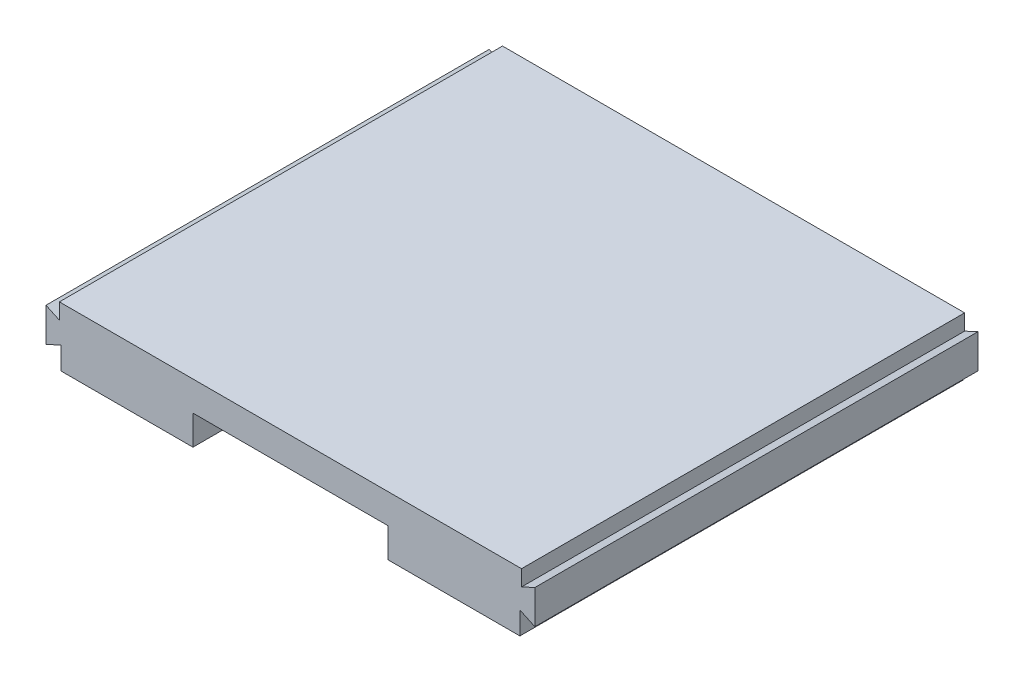
ISO-10303-21;
HEADER;
FILE_DESCRIPTION(('STEP AP214'),'2;1');
FILE_NAME('part.step','',(''),(''),'','','');
FILE_SCHEMA(('AUTOMOTIVE_DESIGN { 1 0 10303 214 1 1 1 1 }'));
ENDSEC;
DATA;
#1=APPLICATION_CONTEXT('core data for automotive mechanical design processes');
#2=APPLICATION_PROTOCOL_DEFINITION('international standard','automotive_design',2000,#1);
#3=PRODUCT_CONTEXT('',#1,'mechanical');
#4=PRODUCT('Part','Part','',(#3));
#5=PRODUCT_RELATED_PRODUCT_CATEGORY('part','',(#4));
#6=PRODUCT_DEFINITION_FORMATION('','',#4);
#7=PRODUCT_DEFINITION_CONTEXT('part definition',#1,'design');
#8=PRODUCT_DEFINITION('design','',#6,#7);
#9=PRODUCT_DEFINITION_SHAPE('','',#8);
#10=(LENGTH_UNIT() NAMED_UNIT(*) SI_UNIT(.MILLI.,.METRE.));
#11=(NAMED_UNIT(*) PLANE_ANGLE_UNIT() SI_UNIT($,.RADIAN.));
#12=(NAMED_UNIT(*) SI_UNIT($,.STERADIAN.) SOLID_ANGLE_UNIT());
#13=UNCERTAINTY_MEASURE_WITH_UNIT(LENGTH_MEASURE(1.E-05),#10,'distance_accuracy_value','');
#14=(GEOMETRIC_REPRESENTATION_CONTEXT(3) GLOBAL_UNCERTAINTY_ASSIGNED_CONTEXT((#13)) GLOBAL_UNIT_ASSIGNED_CONTEXT((#10,
#11,#12)) REPRESENTATION_CONTEXT('',''));
#15=CARTESIAN_POINT('',(0.,0.,0.));
#16=DIRECTION('',(0.,0.,1.));
#17=DIRECTION('',(1.,0.,0.));
#18=AXIS2_PLACEMENT_3D('',#15,#16,#17);
#19=CARTESIAN_POINT('',(-19.55,10.,-49.));
#20=DIRECTION('',(0.,0.,1.));
#21=DIRECTION('',(1.,0.,0.));
#22=AXIS2_PLACEMENT_3D('',#19,#20,#21);
#23=PLANE('',#22);
#24=DIRECTION('',(-1.,0.,0.));
#25=VECTOR('',#24,1.);
#26=CARTESIAN_POINT('',(0.,4.,-49.));
#27=LINE('',#26,#25);
#28=CARTESIAN_POINT('',(15.6441233676957,4.,-49.));
#29=VERTEX_POINT('',#28);
#30=CARTESIAN_POINT('',(-15.6441233676957,4.,-49.));
#31=VERTEX_POINT('',#30);
#32=EDGE_CURVE('E298',#29,#31,#27,.T.);
#33=ORIENTED_EDGE('',*,*,#32,.F.);
#34=DIRECTION('',(0.,1.,0.));
#35=VECTOR('',#34,1.);
#36=CARTESIAN_POINT('',(15.6441233676957,10.8742849021488,-49.));
#37=LINE('',#36,#35);
#38=CARTESIAN_POINT('',(15.6441233676957,2.92758278901282,-49.));
#39=VERTEX_POINT('',#38);
#40=EDGE_CURVE('E68',#39,#29,#37,.T.);
#41=ORIENTED_EDGE('',*,*,#40,.F.);
#42=DIRECTION('',(-0.906307787036648,-0.422618261740704,0.));
#43=VECTOR('',#42,1.);
#44=CARTESIAN_POINT('',(15.6441233676957,2.92758278901282,-49.));
#45=LINE('',#44,#43);
#46=CARTESIAN_POINT('',(16.55,3.35,-49.));
#47=VERTEX_POINT('',#46);
#48=EDGE_CURVE('E171',#47,#39,#45,.T.);
#49=ORIENTED_EDGE('',*,*,#48,.F.);
#50=DIRECTION('',(0.,1.,0.));
#51=VECTOR('',#50,1.);
#52=CARTESIAN_POINT('',(16.55,3.35,-49.));
#53=LINE('',#52,#51);
#54=CARTESIAN_POINT('',(16.55,1.05,-49.));
#55=VERTEX_POINT('',#54);
#56=EDGE_CURVE('E185',#55,#47,#53,.T.);
#57=ORIENTED_EDGE('',*,*,#56,.F.);
#58=DIRECTION('',(0.906307787036648,-0.422618261740704,0.));
#59=VECTOR('',#58,1.);
#60=CARTESIAN_POINT('',(16.55,1.05,-49.));
#61=LINE('',#60,#59);
#62=CARTESIAN_POINT('',(15.5348884992593,1.52335426667663,-49.));
#63=VERTEX_POINT('',#62);
#64=EDGE_CURVE('E164',#63,#55,#61,.T.);
#65=ORIENTED_EDGE('',*,*,#64,.F.);
#66=DIRECTION('',(0.,1.,0.));
#67=VECTOR('',#66,1.);
#68=CARTESIAN_POINT('',(15.5348884992593,-2.3477838682684,-49.));
#69=LINE('',#68,#67);
#70=CARTESIAN_POINT('',(15.5348884992593,0.,-49.));
#71=VERTEX_POINT('',#70);
#72=EDGE_CURVE('E174',#71,#63,#69,.T.);
#73=ORIENTED_EDGE('',*,*,#72,.F.);
#74=DIRECTION('',(-1.,0.,0.));
#75=VECTOR('',#74,1.);
#76=CARTESIAN_POINT('',(-19.55,0.,-49.));
#77=LINE('',#76,#75);
#78=CARTESIAN_POINT('',(6.6,0.,-48.9999999999999));
#79=VERTEX_POINT('',#78);
#80=EDGE_CURVE('E313',#71,#79,#77,.T.);
#81=ORIENTED_EDGE('',*,*,#80,.T.);
#82=DIRECTION('',(0.,-1.,0.));
#83=VECTOR('',#82,1.);
#84=CARTESIAN_POINT('',(6.6,2.,-48.9999999999999));
#85=LINE('',#84,#83);
#86=CARTESIAN_POINT('',(6.6,2.,-48.9999999999999));
#87=VERTEX_POINT('',#86);
#88=EDGE_CURVE('E285',#87,#79,#85,.T.);
#89=ORIENTED_EDGE('',*,*,#88,.F.);
#90=DIRECTION('',(-1.,0.,0.));
#91=VECTOR('',#90,1.);
#92=CARTESIAN_POINT('',(0.,2.,-48.9999999999999));
#93=LINE('',#92,#91);
#94=CARTESIAN_POINT('',(-6.6,2.,-48.9999999999999));
#95=VERTEX_POINT('',#94);
#96=EDGE_CURVE('E271',#87,#95,#93,.T.);
#97=ORIENTED_EDGE('',*,*,#96,.T.);
#98=DIRECTION('',(0.,-1.,0.));
#99=VECTOR('',#98,1.);
#100=CARTESIAN_POINT('',(-6.6,2.,-48.9999999999999));
#101=LINE('',#100,#99);
#102=CARTESIAN_POINT('',(-6.6,0.,-48.9999999999999));
#103=VERTEX_POINT('',#102);
#104=EDGE_CURVE('E275',#95,#103,#101,.T.);
#105=ORIENTED_EDGE('',*,*,#104,.T.);
#106=CARTESIAN_POINT('',(-15.5348884992593,0.,-49.));
#107=VERTEX_POINT('',#106);
#108=EDGE_CURVE('E312',#103,#107,#77,.T.);
#109=ORIENTED_EDGE('',*,*,#108,.T.);
#110=DIRECTION('',(0.,-1.,0.));
#111=VECTOR('',#110,1.);
#112=CARTESIAN_POINT('',(-15.5348884992593,-2.3477838682684,-49.));
#113=LINE('',#112,#111);
#114=CARTESIAN_POINT('',(-15.5348884992593,1.52335426667663,-49.));
#115=VERTEX_POINT('',#114);
#116=EDGE_CURVE('E208',#115,#107,#113,.T.);
#117=ORIENTED_EDGE('',*,*,#116,.F.);
#118=DIRECTION('',(0.906307787036648,0.422618261740704,0.));
#119=VECTOR('',#118,1.);
#120=CARTESIAN_POINT('',(-16.55,1.05,-49.));
#121=LINE('',#120,#119);
#122=CARTESIAN_POINT('',(-16.55,1.05,-49.));
#123=VERTEX_POINT('',#122);
#124=EDGE_CURVE('E220',#123,#115,#121,.T.);
#125=ORIENTED_EDGE('',*,*,#124,.F.);
#126=DIRECTION('',(0.,-1.,0.));
#127=VECTOR('',#126,1.);
#128=CARTESIAN_POINT('',(-16.55,3.35,-49.));
#129=LINE('',#128,#127);
#130=CARTESIAN_POINT('',(-16.55,3.35,-49.));
#131=VERTEX_POINT('',#130);
#132=EDGE_CURVE('E224',#131,#123,#129,.T.);
#133=ORIENTED_EDGE('',*,*,#132,.F.);
#134=DIRECTION('',(-0.906307787036648,0.422618261740704,0.));
#135=VECTOR('',#134,1.);
#136=CARTESIAN_POINT('',(-15.6441233676957,2.92758278901282,-49.));
#137=LINE('',#136,#135);
#138=CARTESIAN_POINT('',(-15.6441233676957,2.92758278901282,-49.));
#139=VERTEX_POINT('',#138);
#140=EDGE_CURVE('E228',#139,#131,#137,.T.);
#141=ORIENTED_EDGE('',*,*,#140,.F.);
#142=DIRECTION('',(0.,-1.,0.));
#143=VECTOR('',#142,1.);
#144=CARTESIAN_POINT('',(-15.6441233676957,10.8742849021488,-49.));
#145=LINE('',#144,#143);
#146=EDGE_CURVE('E232',#31,#139,#145,.T.);
#147=ORIENTED_EDGE('',*,*,#146,.F.);
#148=EDGE_LOOP('',(#33,#41,#49,#57,#65,#73,#81,#89,#97,#105,#109,#117,#125,#133,#141,#147));
#149=FACE_BOUND('',#148,.T.);
#150=ADVANCED_FACE('F45',(#149),#23,.F.);
#151=CARTESIAN_POINT('',(0.,0.,0.));
#152=DIRECTION('',(0.,1.,0.));
#153=DIRECTION('',(0.,0.,1.));
#154=AXIS2_PLACEMENT_3D('',#151,#152,#153);
#155=PLANE('',#154);
#156=DIRECTION('',(1.,0.,0.));
#157=VECTOR('',#156,1.);
#158=CARTESIAN_POINT('',(0.,0.,-19.));
#159=LINE('',#158,#157);
#160=CARTESIAN_POINT('',(-15.5348884992593,0.,-19.));
#161=VERTEX_POINT('',#160);
#162=CARTESIAN_POINT('',(-6.6,0.,-18.9999999999999));
#163=VERTEX_POINT('',#162);
#164=EDGE_CURVE('E303',#161,#163,#159,.T.);
#165=ORIENTED_EDGE('',*,*,#164,.F.);
#166=DIRECTION('',(0.,0.,-1.));
#167=VECTOR('',#166,1.);
#168=CARTESIAN_POINT('',(-15.5348884992593,0.,0.));
#169=LINE('',#168,#167);
#170=EDGE_CURVE('E252',#161,#107,#169,.T.);
#171=ORIENTED_EDGE('',*,*,#170,.T.);
#172=ORIENTED_EDGE('',*,*,#108,.F.);
#173=DIRECTION('',(0.,0.,1.));
#174=VECTOR('',#173,1.);
#175=CARTESIAN_POINT('',(-6.59999999999999,0.,0.));
#176=LINE('',#175,#174);
#177=EDGE_CURVE('E258',#103,#163,#176,.T.);
#178=ORIENTED_EDGE('',*,*,#177,.T.);
#179=EDGE_LOOP('',(#165,#171,#172,#178));
#180=FACE_BOUND('',#179,.T.);
#181=ADVANCED_FACE('F350',(#180),#155,.F.);
#182=ORIENTED_EDGE('',*,*,#80,.F.);
#183=DIRECTION('',(0.,0.,1.));
#184=VECTOR('',#183,1.);
#185=CARTESIAN_POINT('',(15.5348884992593,0.,0.));
#186=LINE('',#185,#184);
#187=CARTESIAN_POINT('',(15.5348884992593,0.,-19.));
#188=VERTEX_POINT('',#187);
#189=EDGE_CURVE('E177',#71,#188,#186,.T.);
#190=ORIENTED_EDGE('',*,*,#189,.T.);
#191=CARTESIAN_POINT('',(6.6,0.,-18.9999999999999));
#192=VERTEX_POINT('',#191);
#193=EDGE_CURVE('E297',#192,#188,#159,.T.);
#194=ORIENTED_EDGE('',*,*,#193,.F.);
#195=DIRECTION('',(0.,0.,-1.));
#196=VECTOR('',#195,1.);
#197=CARTESIAN_POINT('',(6.59999999999999,0.,0.));
#198=LINE('',#197,#196);
#199=EDGE_CURVE('E264',#192,#79,#198,.T.);
#200=ORIENTED_EDGE('',*,*,#199,.T.);
#201=EDGE_LOOP('',(#182,#190,#194,#200));
#202=FACE_BOUND('',#201,.T.);
#203=ADVANCED_FACE('F335',(#202),#155,.F.);
#204=CARTESIAN_POINT('',(0.,4.,-19.));
#205=DIRECTION('',(0.,0.,-1.));
#206=DIRECTION('',(-1.,0.,0.));
#207=AXIS2_PLACEMENT_3D('',#204,#205,#206);
#208=PLANE('',#207);
#209=DIRECTION('',(-0.906307787036648,-0.422618261740704,0.));
#210=VECTOR('',#209,1.);
#211=CARTESIAN_POINT('',(3.20489697385762,-2.87292373995772,-19.));
#212=LINE('',#211,#210);
#213=CARTESIAN_POINT('',(16.55,3.35,-19.));
#214=VERTEX_POINT('',#213);
#215=CARTESIAN_POINT('',(15.6441233676957,2.92758278901282,-19.));
#216=VERTEX_POINT('',#215);
#217=EDGE_CURVE('E11',#214,#216,#212,.T.);
#218=ORIENTED_EDGE('',*,*,#217,.T.);
#219=DIRECTION('',(0.,1.,0.));
#220=VECTOR('',#219,1.);
#221=CARTESIAN_POINT('',(15.6441233676957,4.,-19.));
#222=LINE('',#221,#220);
#223=CARTESIAN_POINT('',(15.6441233676957,4.,-19.));
#224=VERTEX_POINT('',#223);
#225=EDGE_CURVE('E244',#216,#224,#222,.T.);
#226=ORIENTED_EDGE('',*,*,#225,.T.);
#227=DIRECTION('',(1.,0.,0.));
#228=VECTOR('',#227,1.);
#229=CARTESIAN_POINT('',(0.,4.,-19.));
#230=LINE('',#229,#228);
#231=CARTESIAN_POINT('',(-15.6441233676957,4.,-19.));
#232=VERTEX_POINT('',#231);
#233=EDGE_CURVE('E302',#232,#224,#230,.T.);
#234=ORIENTED_EDGE('',*,*,#233,.F.);
#235=DIRECTION('',(0.,-1.,0.));
#236=VECTOR('',#235,1.);
#237=CARTESIAN_POINT('',(-15.6441233676957,4.,-19.));
#238=LINE('',#237,#236);
#239=CARTESIAN_POINT('',(-15.6441233676957,2.92758278901282,-19.));
#240=VERTEX_POINT('',#239);
#241=EDGE_CURVE('E60',#232,#240,#238,.T.);
#242=ORIENTED_EDGE('',*,*,#241,.T.);
#243=DIRECTION('',(-0.906307787036648,0.422618261740704,0.));
#244=VECTOR('',#243,1.);
#245=CARTESIAN_POINT('',(-3.20489697385762,-2.87292373995772,-19.));
#246=LINE('',#245,#244);
#247=CARTESIAN_POINT('',(-16.55,3.35,-19.));
#248=VERTEX_POINT('',#247);
#249=EDGE_CURVE('E238',#240,#248,#246,.T.);
#250=ORIENTED_EDGE('',*,*,#249,.T.);
#251=DIRECTION('',(0.,-1.,0.));
#252=VECTOR('',#251,1.);
#253=CARTESIAN_POINT('',(-16.55,4.,-19.));
#254=LINE('',#253,#252);
#255=CARTESIAN_POINT('',(-16.55,1.05,-19.));
#256=VERTEX_POINT('',#255);
#257=EDGE_CURVE('E198',#248,#256,#254,.T.);
#258=ORIENTED_EDGE('',*,*,#257,.T.);
#259=DIRECTION('',(0.906307787036648,0.422618261740704,0.));
#260=VECTOR('',#259,1.);
#261=CARTESIAN_POINT('',(-1.82601697624345,7.91590604252196,-19.));
#262=LINE('',#261,#260);
#263=CARTESIAN_POINT('',(-15.5348884992593,1.52335426667663,-19.));
#264=VERTEX_POINT('',#263);
#265=EDGE_CURVE('E248',#256,#264,#262,.T.);
#266=ORIENTED_EDGE('',*,*,#265,.T.);
#267=DIRECTION('',(0.,-1.,0.));
#268=VECTOR('',#267,1.);
#269=CARTESIAN_POINT('',(-15.5348884992593,4.,-19.));
#270=LINE('',#269,#268);
#271=EDGE_CURVE('E322',#264,#161,#270,.T.);
#272=ORIENTED_EDGE('',*,*,#271,.T.);
#273=ORIENTED_EDGE('',*,*,#164,.T.);
#274=DIRECTION('',(0.,-1.,0.));
#275=VECTOR('',#274,1.);
#276=CARTESIAN_POINT('',(-6.6,2.,-18.9999999999999));
#277=LINE('',#276,#275);
#278=CARTESIAN_POINT('',(-6.6,2.,-18.9999999999999));
#279=VERTEX_POINT('',#278);
#280=EDGE_CURVE('E293',#279,#163,#277,.T.);
#281=ORIENTED_EDGE('',*,*,#280,.F.);
#282=DIRECTION('',(1.,0.,0.));
#283=VECTOR('',#282,1.);
#284=CARTESIAN_POINT('',(0.,2.,-18.9999999999999));
#285=LINE('',#284,#283);
#286=CARTESIAN_POINT('',(6.6,2.,-19.));
#287=VERTEX_POINT('',#286);
#288=EDGE_CURVE('E263',#279,#287,#285,.T.);
#289=ORIENTED_EDGE('',*,*,#288,.T.);
#290=DIRECTION('',(0.,-1.,0.));
#291=VECTOR('',#290,1.);
#292=CARTESIAN_POINT('',(6.6,2.,-18.9999999999999));
#293=LINE('',#292,#291);
#294=EDGE_CURVE('E289',#287,#192,#293,.T.);
#295=ORIENTED_EDGE('',*,*,#294,.T.);
#296=ORIENTED_EDGE('',*,*,#193,.T.);
#297=DIRECTION('',(0.,1.,0.));
#298=VECTOR('',#297,1.);
#299=CARTESIAN_POINT('',(15.5348884992593,4.,-19.));
#300=LINE('',#299,#298);
#301=CARTESIAN_POINT('',(15.5348884992593,1.52335426667663,-19.));
#302=VERTEX_POINT('',#301);
#303=EDGE_CURVE('E326',#188,#302,#300,.T.);
#304=ORIENTED_EDGE('',*,*,#303,.T.);
#305=DIRECTION('',(0.906307787036648,-0.422618261740704,0.));
#306=VECTOR('',#305,1.);
#307=CARTESIAN_POINT('',(1.82601697624345,7.91590604252196,-19.));
#308=LINE('',#307,#306);
#309=CARTESIAN_POINT('',(16.55,1.05,-19.));
#310=VERTEX_POINT('',#309);
#311=EDGE_CURVE('E53',#302,#310,#308,.T.);
#312=ORIENTED_EDGE('',*,*,#311,.T.);
#313=DIRECTION('',(0.,-1.,0.));
#314=VECTOR('',#313,1.);
#315=CARTESIAN_POINT('',(16.55,4.,-19.));
#316=LINE('',#315,#314);
#317=EDGE_CURVE('E307',#214,#310,#316,.T.);
#318=ORIENTED_EDGE('',*,*,#317,.F.);
#319=EDGE_LOOP('',(#218,#226,#234,#242,#250,#258,#266,#272,#273,#281,#289,#295,#296,#304,#312,#318));
#320=FACE_BOUND('',#319,.T.);
#321=ADVANCED_FACE('F331',(#320),#208,.F.);
#322=CARTESIAN_POINT('',(0.,4.,0.));
#323=DIRECTION('',(0.,1.,0.));
#324=DIRECTION('',(0.,0.,1.));
#325=AXIS2_PLACEMENT_3D('',#322,#323,#324);
#326=PLANE('',#325);
#327=DIRECTION('',(0.,0.,1.));
#328=VECTOR('',#327,1.);
#329=CARTESIAN_POINT('',(15.6441233676957,4.,0.));
#330=LINE('',#329,#328);
#331=EDGE_CURVE('E319',#29,#224,#330,.T.);
#332=ORIENTED_EDGE('',*,*,#331,.F.);
#333=ORIENTED_EDGE('',*,*,#32,.T.);
#334=DIRECTION('',(0.,0.,-1.));
#335=VECTOR('',#334,1.);
#336=CARTESIAN_POINT('',(-15.6441233676957,4.,0.));
#337=LINE('',#336,#335);
#338=EDGE_CURVE('E316',#232,#31,#337,.T.);
#339=ORIENTED_EDGE('',*,*,#338,.F.);
#340=ORIENTED_EDGE('',*,*,#233,.T.);
#341=EDGE_LOOP('',(#332,#333,#339,#340));
#342=FACE_BOUND('',#341,.T.);
#343=ADVANCED_FACE('F372',(#342),#326,.T.);
#344=CARTESIAN_POINT('',(-6.59999999999999,2.,0.));
#345=DIRECTION('',(1.,0.,0.));
#346=DIRECTION('',(0.,0.,-1.));
#347=AXIS2_PLACEMENT_3D('',#344,#345,#346);
#348=PLANE('',#347);
#349=ORIENTED_EDGE('',*,*,#177,.F.);
#350=ORIENTED_EDGE('',*,*,#104,.F.);
#351=DIRECTION('',(0.,0.,1.));
#352=VECTOR('',#351,1.);
#353=CARTESIAN_POINT('',(-6.59999999999999,2.,0.));
#354=LINE('',#353,#352);
#355=EDGE_CURVE('E259',#95,#279,#354,.T.);
#356=ORIENTED_EDGE('',*,*,#355,.T.);
#357=ORIENTED_EDGE('',*,*,#280,.T.);
#358=EDGE_LOOP('',(#349,#350,#356,#357));
#359=FACE_BOUND('',#358,.T.);
#360=ADVANCED_FACE('F401',(#359),#348,.T.);
#361=CARTESIAN_POINT('',(6.59999999999999,2.,0.));
#362=DIRECTION('',(-1.,0.,0.));
#363=DIRECTION('',(0.,0.,1.));
#364=AXIS2_PLACEMENT_3D('',#361,#362,#363);
#365=PLANE('',#364);
#366=ORIENTED_EDGE('',*,*,#199,.F.);
#367=ORIENTED_EDGE('',*,*,#294,.F.);
#368=DIRECTION('',(0.,0.,-1.));
#369=VECTOR('',#368,1.);
#370=CARTESIAN_POINT('',(6.59999999999999,2.,0.));
#371=LINE('',#370,#369);
#372=EDGE_CURVE('E268',#287,#87,#371,.T.);
#373=ORIENTED_EDGE('',*,*,#372,.T.);
#374=ORIENTED_EDGE('',*,*,#88,.T.);
#375=EDGE_LOOP('',(#366,#367,#373,#374));
#376=FACE_BOUND('',#375,.T.);
#377=ADVANCED_FACE('F338',(#376),#365,.T.);
#378=CARTESIAN_POINT('',(0.,2.,0.));
#379=DIRECTION('',(0.,1.,0.));
#380=DIRECTION('',(0.,0.,1.));
#381=AXIS2_PLACEMENT_3D('',#378,#379,#380);
#382=PLANE('',#381);
#383=ORIENTED_EDGE('',*,*,#355,.F.);
#384=ORIENTED_EDGE('',*,*,#96,.F.);
#385=ORIENTED_EDGE('',*,*,#372,.F.);
#386=ORIENTED_EDGE('',*,*,#288,.F.);
#387=EDGE_LOOP('',(#383,#384,#385,#386));
#388=FACE_BOUND('',#387,.T.);
#389=ADVANCED_FACE('F343',(#388),#382,.F.);
#390=CARTESIAN_POINT('',(-15.5348884992593,-2.3477838682684,0.));
#391=DIRECTION('',(1.,0.,0.));
#392=DIRECTION('',(0.,0.,-1.));
#393=AXIS2_PLACEMENT_3D('',#390,#391,#392);
#394=PLANE('',#393);
#395=ORIENTED_EDGE('',*,*,#271,.F.);
#396=DIRECTION('',(0.,0.,-1.));
#397=VECTOR('',#396,1.);
#398=CARTESIAN_POINT('',(-15.5348884992593,1.52335426667663,0.));
#399=LINE('',#398,#397);
#400=EDGE_CURVE('E215',#264,#115,#399,.T.);
#401=ORIENTED_EDGE('',*,*,#400,.T.);
#402=ORIENTED_EDGE('',*,*,#116,.T.);
#403=ORIENTED_EDGE('',*,*,#170,.F.);
#404=EDGE_LOOP('',(#395,#401,#402,#403));
#405=FACE_BOUND('',#404,.T.);
#406=ADVANCED_FACE('F354',(#405),#394,.F.);
#407=CARTESIAN_POINT('',(-16.55,1.05,0.));
#408=DIRECTION('',(-0.422618261740704,0.906307787036648,0.));
#409=DIRECTION('',(-0.906307787036648,-0.422618261740704,0.));
#410=AXIS2_PLACEMENT_3D('',#407,#408,#409);
#411=PLANE('',#410);
#412=DIRECTION('',(0.,0.,-1.));
#413=VECTOR('',#412,1.);
#414=CARTESIAN_POINT('',(-16.55,1.05,0.));
#415=LINE('',#414,#413);
#416=EDGE_CURVE('E212',#256,#123,#415,.T.);
#417=ORIENTED_EDGE('',*,*,#416,.T.);
#418=ORIENTED_EDGE('',*,*,#124,.T.);
#419=ORIENTED_EDGE('',*,*,#400,.F.);
#420=ORIENTED_EDGE('',*,*,#265,.F.);
#421=EDGE_LOOP('',(#417,#418,#419,#420));
#422=FACE_BOUND('',#421,.T.);
#423=ADVANCED_FACE('F359',(#422),#411,.F.);
#424=CARTESIAN_POINT('',(-15.6441233676957,10.8742849021488,0.));
#425=DIRECTION('',(1.,0.,0.));
#426=DIRECTION('',(0.,0.,-1.));
#427=AXIS2_PLACEMENT_3D('',#424,#425,#426);
#428=PLANE('',#427);
#429=ORIENTED_EDGE('',*,*,#338,.T.);
#430=ORIENTED_EDGE('',*,*,#146,.T.);
#431=DIRECTION('',(0.,0.,-1.));
#432=VECTOR('',#431,1.);
#433=CARTESIAN_POINT('',(-15.6441233676957,2.92758278901282,0.));
#434=LINE('',#433,#432);
#435=EDGE_CURVE('E204',#240,#139,#434,.T.);
#436=ORIENTED_EDGE('',*,*,#435,.F.);
#437=ORIENTED_EDGE('',*,*,#241,.F.);
#438=EDGE_LOOP('',(#429,#430,#436,#437));
#439=FACE_BOUND('',#438,.T.);
#440=ADVANCED_FACE('F369',(#439),#428,.F.);
#441=CARTESIAN_POINT('',(-15.6441233676957,2.92758278901282,0.));
#442=DIRECTION('',(-0.422618261740704,-0.906307787036648,0.));
#443=DIRECTION('',(0.906307787036648,-0.422618261740704,0.));
#444=AXIS2_PLACEMENT_3D('',#441,#442,#443);
#445=PLANE('',#444);
#446=ORIENTED_EDGE('',*,*,#435,.T.);
#447=ORIENTED_EDGE('',*,*,#140,.T.);
#448=DIRECTION('',(0.,0.,-1.));
#449=VECTOR('',#448,1.);
#450=CARTESIAN_POINT('',(-16.55,3.35,0.));
#451=LINE('',#450,#449);
#452=EDGE_CURVE('E209',#248,#131,#451,.T.);
#453=ORIENTED_EDGE('',*,*,#452,.F.);
#454=ORIENTED_EDGE('',*,*,#249,.F.);
#455=EDGE_LOOP('',(#446,#447,#453,#454));
#456=FACE_BOUND('',#455,.T.);
#457=ADVANCED_FACE('F368',(#456),#445,.F.);
#458=CARTESIAN_POINT('',(-16.55,3.35,0.));
#459=DIRECTION('',(1.,0.,0.));
#460=DIRECTION('',(0.,0.,-1.));
#461=AXIS2_PLACEMENT_3D('',#458,#459,#460);
#462=PLANE('',#461);
#463=ORIENTED_EDGE('',*,*,#452,.T.);
#464=ORIENTED_EDGE('',*,*,#132,.T.);
#465=ORIENTED_EDGE('',*,*,#416,.F.);
#466=ORIENTED_EDGE('',*,*,#257,.F.);
#467=EDGE_LOOP('',(#463,#464,#465,#466));
#468=FACE_BOUND('',#467,.T.);
#469=ADVANCED_FACE('F361',(#468),#462,.F.);
#470=CARTESIAN_POINT('',(15.6441233676957,2.92758278901282,0.));
#471=DIRECTION('',(0.422618261740704,-0.906307787036648,0.));
#472=DIRECTION('',(0.906307787036648,0.422618261740704,0.));
#473=AXIS2_PLACEMENT_3D('',#470,#471,#472);
#474=PLANE('',#473);
#475=DIRECTION('',(0.,0.,-1.));
#476=VECTOR('',#475,1.);
#477=CARTESIAN_POINT('',(16.55,3.35,0.));
#478=LINE('',#477,#476);
#479=EDGE_CURVE('E199',#214,#47,#478,.T.);
#480=ORIENTED_EDGE('',*,*,#479,.T.);
#481=ORIENTED_EDGE('',*,*,#48,.T.);
#482=DIRECTION('',(0.,0.,-1.));
#483=VECTOR('',#482,1.);
#484=CARTESIAN_POINT('',(15.6441233676957,2.92758278901282,0.));
#485=LINE('',#484,#483);
#486=EDGE_CURVE('E195',#216,#39,#485,.T.);
#487=ORIENTED_EDGE('',*,*,#486,.F.);
#488=ORIENTED_EDGE('',*,*,#217,.F.);
#489=EDGE_LOOP('',(#480,#481,#487,#488));
#490=FACE_BOUND('',#489,.T.);
#491=ADVANCED_FACE('F376',(#490),#474,.F.);
#492=CARTESIAN_POINT('',(16.55,3.35,0.));
#493=DIRECTION('',(-1.,0.,0.));
#494=DIRECTION('',(0.,0.,1.));
#495=AXIS2_PLACEMENT_3D('',#492,#493,#494);
#496=PLANE('',#495);
#497=DIRECTION('',(0.,0.,-1.));
#498=VECTOR('',#497,1.);
#499=CARTESIAN_POINT('',(16.55,1.05,0.));
#500=LINE('',#499,#498);
#501=EDGE_CURVE('E170',#310,#55,#500,.T.);
#502=ORIENTED_EDGE('',*,*,#501,.T.);
#503=ORIENTED_EDGE('',*,*,#56,.T.);
#504=ORIENTED_EDGE('',*,*,#479,.F.);
#505=ORIENTED_EDGE('',*,*,#317,.T.);
#506=EDGE_LOOP('',(#502,#503,#504,#505));
#507=FACE_BOUND('',#506,.T.);
#508=ADVANCED_FACE('F379',(#507),#496,.F.);
#509=CARTESIAN_POINT('',(16.55,1.05,0.));
#510=DIRECTION('',(0.422618261740704,0.906307787036648,0.));
#511=DIRECTION('',(-0.906307787036648,0.422618261740704,0.));
#512=AXIS2_PLACEMENT_3D('',#509,#510,#511);
#513=PLANE('',#512);
#514=DIRECTION('',(0.,0.,-1.));
#515=VECTOR('',#514,1.);
#516=CARTESIAN_POINT('',(15.5348884992593,1.52335426667663,0.));
#517=LINE('',#516,#515);
#518=EDGE_CURVE('E159',#302,#63,#517,.T.);
#519=ORIENTED_EDGE('',*,*,#518,.T.);
#520=ORIENTED_EDGE('',*,*,#64,.T.);
#521=ORIENTED_EDGE('',*,*,#501,.F.);
#522=ORIENTED_EDGE('',*,*,#311,.F.);
#523=EDGE_LOOP('',(#519,#520,#521,#522));
#524=FACE_BOUND('',#523,.T.);
#525=ADVANCED_FACE('F161',(#524),#513,.F.);
#526=CARTESIAN_POINT('',(15.5348884992593,-2.3477838682684,0.));
#527=DIRECTION('',(-1.,0.,0.));
#528=DIRECTION('',(0.,0.,1.));
#529=AXIS2_PLACEMENT_3D('',#526,#527,#528);
#530=PLANE('',#529);
#531=ORIENTED_EDGE('',*,*,#72,.T.);
#532=ORIENTED_EDGE('',*,*,#518,.F.);
#533=ORIENTED_EDGE('',*,*,#303,.F.);
#534=ORIENTED_EDGE('',*,*,#189,.F.);
#535=EDGE_LOOP('',(#531,#532,#533,#534));
#536=FACE_BOUND('',#535,.T.);
#537=ADVANCED_FACE('F175',(#536),#530,.F.);
#538=CARTESIAN_POINT('',(15.6441233676957,10.8742849021488,0.));
#539=DIRECTION('',(-1.,0.,0.));
#540=DIRECTION('',(0.,0.,1.));
#541=AXIS2_PLACEMENT_3D('',#538,#539,#540);
#542=PLANE('',#541);
#543=ORIENTED_EDGE('',*,*,#486,.T.);
#544=ORIENTED_EDGE('',*,*,#40,.T.);
#545=ORIENTED_EDGE('',*,*,#331,.T.);
#546=ORIENTED_EDGE('',*,*,#225,.F.);
#547=EDGE_LOOP('',(#543,#544,#545,#546));
#548=FACE_BOUND('',#547,.T.);
#549=ADVANCED_FACE('F417',(#548),#542,.F.);
#550=CLOSED_SHELL('',(#150,#181,#203,#321,#343,#360,#377,#389,#406,#423,#440,#457,#469,#491,
#508,#525,#537,#549));
#551=MANIFOLD_SOLID_BREP('B2',#550);
#552=ADVANCED_BREP_SHAPE_REPRESENTATION('',(#18,#551),#14);
#553=SHAPE_DEFINITION_REPRESENTATION(#9,#552);
ENDSEC;
END-ISO-10303-21;
